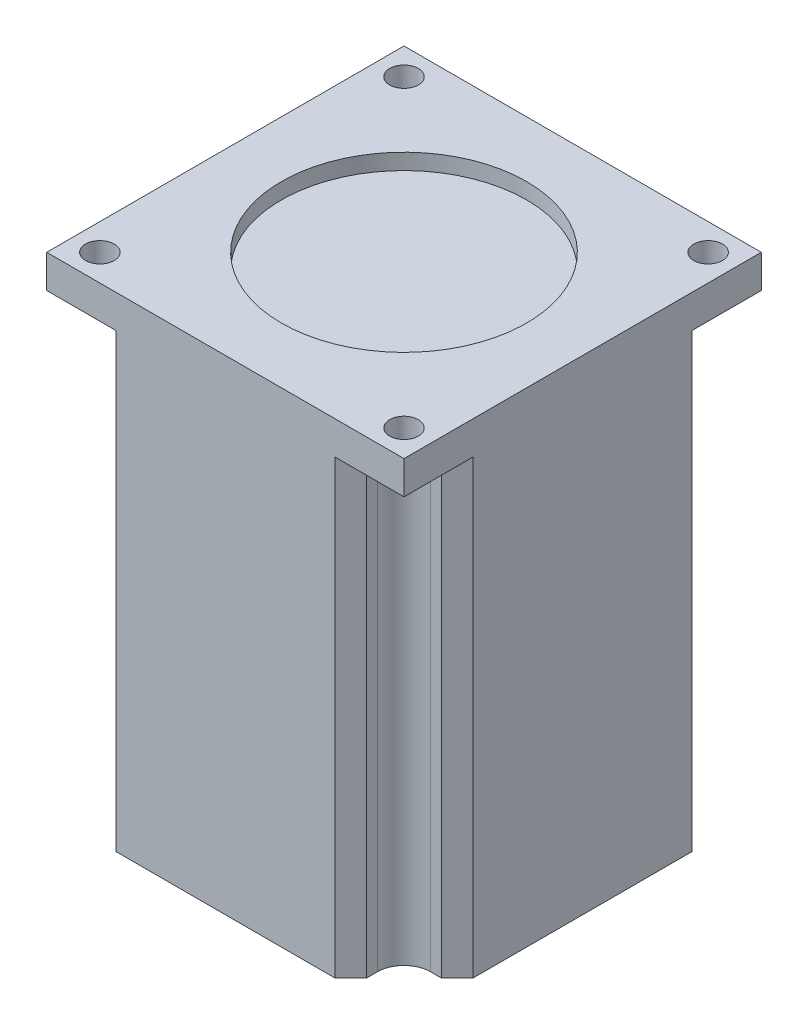
ISO-10303-21;
HEADER;
FILE_DESCRIPTION(('STEP AP214'),'2;1');
FILE_NAME('part.step','',(''),(''),'','','');
FILE_SCHEMA(('AUTOMOTIVE_DESIGN { 1 0 10303 214 1 1 1 1 }'));
ENDSEC;
DATA;
#1=APPLICATION_CONTEXT('core data for automotive mechanical design processes');
#2=APPLICATION_PROTOCOL_DEFINITION('international standard','automotive_design',2000,#1);
#3=PRODUCT_CONTEXT('',#1,'mechanical');
#4=PRODUCT('Part','Part','',(#3));
#5=PRODUCT_RELATED_PRODUCT_CATEGORY('part','',(#4));
#6=PRODUCT_DEFINITION_FORMATION('','',#4);
#7=PRODUCT_DEFINITION_CONTEXT('part definition',#1,'design');
#8=PRODUCT_DEFINITION('design','',#6,#7);
#9=PRODUCT_DEFINITION_SHAPE('','',#8);
#10=(LENGTH_UNIT() NAMED_UNIT(*) SI_UNIT(.MILLI.,.METRE.));
#11=(NAMED_UNIT(*) PLANE_ANGLE_UNIT() SI_UNIT($,.RADIAN.));
#12=(NAMED_UNIT(*) SI_UNIT($,.STERADIAN.) SOLID_ANGLE_UNIT());
#13=UNCERTAINTY_MEASURE_WITH_UNIT(LENGTH_MEASURE(1.E-05),#10,'distance_accuracy_value','');
#14=(GEOMETRIC_REPRESENTATION_CONTEXT(3) GLOBAL_UNCERTAINTY_ASSIGNED_CONTEXT((#13)) GLOBAL_UNIT_ASSIGNED_CONTEXT((#10,
#11,#12)) REPRESENTATION_CONTEXT('',''));
#15=CARTESIAN_POINT('',(0.,0.,0.));
#16=DIRECTION('',(0.,0.,1.));
#17=DIRECTION('',(1.,0.,0.));
#18=AXIS2_PLACEMENT_3D('',#15,#16,#17);
#19=CARTESIAN_POINT('',(0.,0.,0.));
#20=DIRECTION('',(0.,-1.,0.));
#21=DIRECTION('',(0.,0.,-1.));
#22=AXIS2_PLACEMENT_3D('',#19,#20,#21);
#23=PLANE('',#22);
#24=DIRECTION('',(-1.,0.,0.));
#25=VECTOR('',#24,1.);
#26=CARTESIAN_POINT('',(28.05,0.,-19.7));
#27=LINE('',#26,#25);
#28=CARTESIAN_POINT('',(25.55,0.,-19.7));
#29=VERTEX_POINT('',#28);
#30=CARTESIAN_POINT('',(23.875,0.,-19.7));
#31=VERTEX_POINT('',#30);
#32=EDGE_CURVE('E290',#29,#31,#27,.T.);
#33=ORIENTED_EDGE('',*,*,#32,.F.);
#34=DIRECTION('',(0.707106781186551,0.,0.707106781186544));
#35=VECTOR('',#34,1.);
#36=CARTESIAN_POINT('',(22.6249999999999,0.,-22.6250000000001));
#37=LINE('',#36,#35);
#38=CARTESIAN_POINT('',(28.05,0.,-17.2));
#39=VERTEX_POINT('',#38);
#40=EDGE_CURVE('E460',#29,#39,#37,.T.);
#41=ORIENTED_EDGE('',*,*,#40,.T.);
#42=DIRECTION('',(0.,0.,-1.));
#43=VECTOR('',#42,1.);
#44=CARTESIAN_POINT('',(28.05,0.,-28.05));
#45=LINE('',#44,#43);
#46=CARTESIAN_POINT('',(28.05,0.,17.2));
#47=VERTEX_POINT('',#46);
#48=EDGE_CURVE('E408',#47,#39,#45,.T.);
#49=ORIENTED_EDGE('',*,*,#48,.F.);
#50=DIRECTION('',(0.707106781186545,0.,-0.70710678118655));
#51=VECTOR('',#50,1.);
#52=CARTESIAN_POINT('',(22.6250000000001,0.,22.6249999999999));
#53=LINE('',#52,#51);
#54=CARTESIAN_POINT('',(25.55,0.,19.7));
#55=VERTEX_POINT('',#54);
#56=EDGE_CURVE('E236',#47,#55,#53,.F.);
#57=ORIENTED_EDGE('',*,*,#56,.T.);
#58=DIRECTION('',(-1.,0.,0.));
#59=VECTOR('',#58,1.);
#60=CARTESIAN_POINT('',(28.05,0.,19.7));
#61=LINE('',#60,#59);
#62=CARTESIAN_POINT('',(23.875,0.,19.7));
#63=VERTEX_POINT('',#62);
#64=EDGE_CURVE('E228',#55,#63,#61,.T.);
#65=ORIENTED_EDGE('',*,*,#64,.T.);
#66=CARTESIAN_POINT('',(23.875,0.,23.875));
#67=DIRECTION('',(0.,1.,0.));
#68=DIRECTION('',(0.,0.,-1.));
#69=AXIS2_PLACEMENT_3D('',#66,#67,#68);
#70=CIRCLE('',#69,4.17500000000001);
#71=CARTESIAN_POINT('',(19.7,0.,23.875));
#72=VERTEX_POINT('',#71);
#73=EDGE_CURVE('E233',#63,#72,#70,.T.);
#74=ORIENTED_EDGE('',*,*,#73,.T.);
#75=DIRECTION('',(0.,0.,1.));
#76=VECTOR('',#75,1.);
#77=CARTESIAN_POINT('',(19.7,0.,23.875));
#78=LINE('',#77,#76);
#79=CARTESIAN_POINT('',(19.7,0.,25.55));
#80=VERTEX_POINT('',#79);
#81=EDGE_CURVE('E253',#72,#80,#78,.T.);
#82=ORIENTED_EDGE('',*,*,#81,.T.);
#83=DIRECTION('',(0.707106781186546,0.,-0.707106781186549));
#84=VECTOR('',#83,1.);
#85=CARTESIAN_POINT('',(22.6250000000001,0.,22.6249999999999));
#86=LINE('',#85,#84);
#87=CARTESIAN_POINT('',(17.2,0.,28.05));
#88=VERTEX_POINT('',#87);
#89=EDGE_CURVE('E452',#80,#88,#86,.F.);
#90=ORIENTED_EDGE('',*,*,#89,.T.);
#91=DIRECTION('',(1.,0.,0.));
#92=VECTOR('',#91,1.);
#93=CARTESIAN_POINT('',(28.05,0.,28.05));
#94=LINE('',#93,#92);
#95=CARTESIAN_POINT('',(-17.2,0.,28.05));
#96=VERTEX_POINT('',#95);
#97=EDGE_CURVE('E404',#96,#88,#94,.T.);
#98=ORIENTED_EDGE('',*,*,#97,.F.);
#99=DIRECTION('',(-0.70710678118655,0.,-0.707106781186545));
#100=VECTOR('',#99,1.);
#101=CARTESIAN_POINT('',(-22.6249999999999,0.,22.6250000000001));
#102=LINE('',#101,#100);
#103=CARTESIAN_POINT('',(-19.7,0.,25.55));
#104=VERTEX_POINT('',#103);
#105=EDGE_CURVE('E449',#96,#104,#102,.T.);
#106=ORIENTED_EDGE('',*,*,#105,.T.);
#107=DIRECTION('',(0.,0.,1.));
#108=VECTOR('',#107,1.);
#109=CARTESIAN_POINT('',(-19.7,0.,23.875));
#110=LINE('',#109,#108);
#111=CARTESIAN_POINT('',(-19.7,0.,23.875));
#112=VERTEX_POINT('',#111);
#113=EDGE_CURVE('E316',#112,#104,#110,.T.);
#114=ORIENTED_EDGE('',*,*,#113,.F.);
#115=CARTESIAN_POINT('',(-23.875,0.,23.875));
#116=DIRECTION('',(0.,-1.,0.));
#117=DIRECTION('',(0.,0.,-1.));
#118=AXIS2_PLACEMENT_3D('',#115,#116,#117);
#119=CIRCLE('',#118,4.17500000000001);
#120=CARTESIAN_POINT('',(-23.875,0.,19.7));
#121=VERTEX_POINT('',#120);
#122=EDGE_CURVE('E320',#121,#112,#119,.T.);
#123=ORIENTED_EDGE('',*,*,#122,.F.);
#124=DIRECTION('',(1.,0.,0.));
#125=VECTOR('',#124,1.);
#126=CARTESIAN_POINT('',(-28.05,0.,19.7));
#127=LINE('',#126,#125);
#128=CARTESIAN_POINT('',(-25.55,0.,19.7));
#129=VERTEX_POINT('',#128);
#130=EDGE_CURVE('E325',#129,#121,#127,.T.);
#131=ORIENTED_EDGE('',*,*,#130,.F.);
#132=DIRECTION('',(-0.707106781186552,0.,-0.707106781186543));
#133=VECTOR('',#132,1.);
#134=CARTESIAN_POINT('',(-22.6249999999998,0.,22.6250000000001));
#135=LINE('',#134,#133);
#136=CARTESIAN_POINT('',(-28.05,0.,17.2));
#137=VERTEX_POINT('',#136);
#138=EDGE_CURVE('E446',#129,#137,#135,.T.);
#139=ORIENTED_EDGE('',*,*,#138,.T.);
#140=DIRECTION('',(0.,0.,1.));
#141=VECTOR('',#140,1.);
#142=CARTESIAN_POINT('',(-28.05,0.,-28.05));
#143=LINE('',#142,#141);
#144=CARTESIAN_POINT('',(-28.05,0.,-17.2));
#145=VERTEX_POINT('',#144);
#146=EDGE_CURVE('E382',#145,#137,#143,.T.);
#147=ORIENTED_EDGE('',*,*,#146,.F.);
#148=DIRECTION('',(-0.707106781186546,0.,0.707106781186549));
#149=VECTOR('',#148,1.);
#150=CARTESIAN_POINT('',(-22.6250000000001,0.,-22.6249999999999));
#151=LINE('',#150,#149);
#152=CARTESIAN_POINT('',(-25.55,0.,-19.7));
#153=VERTEX_POINT('',#152);
#154=EDGE_CURVE('E440',#145,#153,#151,.F.);
#155=ORIENTED_EDGE('',*,*,#154,.T.);
#156=DIRECTION('',(1.,0.,0.));
#157=VECTOR('',#156,1.);
#158=CARTESIAN_POINT('',(-28.05,0.,-19.7));
#159=LINE('',#158,#157);
#160=CARTESIAN_POINT('',(-23.875,0.,-19.7));
#161=VERTEX_POINT('',#160);
#162=EDGE_CURVE('E351',#153,#161,#159,.T.);
#163=ORIENTED_EDGE('',*,*,#162,.T.);
#164=CARTESIAN_POINT('',(-23.875,0.,-23.875));
#165=DIRECTION('',(0.,1.,0.));
#166=DIRECTION('',(0.,0.,1.));
#167=AXIS2_PLACEMENT_3D('',#164,#165,#166);
#168=CIRCLE('',#167,4.17500000000001);
#169=CARTESIAN_POINT('',(-19.7,0.,-23.875));
#170=VERTEX_POINT('',#169);
#171=EDGE_CURVE('E354',#161,#170,#168,.T.);
#172=ORIENTED_EDGE('',*,*,#171,.T.);
#173=DIRECTION('',(0.,0.,-1.));
#174=VECTOR('',#173,1.);
#175=CARTESIAN_POINT('',(-19.7,0.,-23.875));
#176=LINE('',#175,#174);
#177=CARTESIAN_POINT('',(-19.7,0.,-25.55));
#178=VERTEX_POINT('',#177);
#179=EDGE_CURVE('E359',#170,#178,#176,.T.);
#180=ORIENTED_EDGE('',*,*,#179,.T.);
#181=DIRECTION('',(-0.707106781186546,0.,0.707106781186549));
#182=VECTOR('',#181,1.);
#183=CARTESIAN_POINT('',(-22.625,0.,-22.6249999999999));
#184=LINE('',#183,#182);
#185=CARTESIAN_POINT('',(-17.2,0.,-28.05));
#186=VERTEX_POINT('',#185);
#187=EDGE_CURVE('E443',#178,#186,#184,.F.);
#188=ORIENTED_EDGE('',*,*,#187,.T.);
#189=DIRECTION('',(-1.,0.,0.));
#190=VECTOR('',#189,1.);
#191=CARTESIAN_POINT('',(28.05,0.,-28.05));
#192=LINE('',#191,#190);
#193=CARTESIAN_POINT('',(17.2,0.,-28.05));
#194=VERTEX_POINT('',#193);
#195=EDGE_CURVE('E391',#194,#186,#192,.T.);
#196=ORIENTED_EDGE('',*,*,#195,.F.);
#197=DIRECTION('',(0.707106781186549,0.,0.707106781186546));
#198=VECTOR('',#197,1.);
#199=CARTESIAN_POINT('',(22.625,0.,-22.6250000000001));
#200=LINE('',#199,#198);
#201=CARTESIAN_POINT('',(19.7,0.,-25.55));
#202=VERTEX_POINT('',#201);
#203=EDGE_CURVE('E457',#194,#202,#200,.T.);
#204=ORIENTED_EDGE('',*,*,#203,.T.);
#205=DIRECTION('',(0.,0.,-1.));
#206=VECTOR('',#205,1.);
#207=CARTESIAN_POINT('',(19.7,0.,-23.875));
#208=LINE('',#207,#206);
#209=CARTESIAN_POINT('',(19.7,0.,-23.875));
#210=VERTEX_POINT('',#209);
#211=EDGE_CURVE('E282',#210,#202,#208,.T.);
#212=ORIENTED_EDGE('',*,*,#211,.F.);
#213=CARTESIAN_POINT('',(23.875,0.,-23.875));
#214=DIRECTION('',(0.,-1.,0.));
#215=DIRECTION('',(0.,0.,1.));
#216=AXIS2_PLACEMENT_3D('',#213,#214,#215);
#217=CIRCLE('',#216,4.17500000000001);
#218=EDGE_CURVE('E286',#31,#210,#217,.T.);
#219=ORIENTED_EDGE('',*,*,#218,.F.);
#220=EDGE_LOOP('',(#33,#41,#49,#57,#65,#74,#82,#90,#98,#106,#114,#123,#131,#139,#147,#155,#163,
#172,#180,#188,#196,#204,#212,#219));
#221=FACE_BOUND('',#220,.T.);
#222=ADVANCED_FACE('F41',(#221),#23,.T.);
#223=CARTESIAN_POINT('',(28.05,76.05,-28.05));
#224=DIRECTION('',(-1.,0.,0.));
#225=DIRECTION('',(0.,0.,1.));
#226=AXIS2_PLACEMENT_3D('',#223,#224,#225);
#227=PLANE('',#226);
#228=ORIENTED_EDGE('',*,*,#48,.T.);
#229=DIRECTION('',(0.,1.,0.));
#230=VECTOR('',#229,1.);
#231=CARTESIAN_POINT('',(28.05,70.85,-17.2));
#232=LINE('',#231,#230);
#233=CARTESIAN_POINT('',(28.05,70.85,-17.2));
#234=VERTEX_POINT('',#233);
#235=EDGE_CURVE('E433',#39,#234,#232,.T.);
#236=ORIENTED_EDGE('',*,*,#235,.T.);
#237=DIRECTION('',(0.,0.,1.));
#238=VECTOR('',#237,1.);
#239=CARTESIAN_POINT('',(28.05,70.85,-19.7));
#240=LINE('',#239,#238);
#241=CARTESIAN_POINT('',(28.05,70.85,-28.05));
#242=VERTEX_POINT('',#241);
#243=EDGE_CURVE('E280',#242,#234,#240,.T.);
#244=ORIENTED_EDGE('',*,*,#243,.F.);
#245=DIRECTION('',(0.,-1.,0.));
#246=VECTOR('',#245,1.);
#247=CARTESIAN_POINT('',(28.05,76.05,-28.05));
#248=LINE('',#247,#246);
#249=CARTESIAN_POINT('',(28.05,76.05,-28.05));
#250=VERTEX_POINT('',#249);
#251=EDGE_CURVE('E418',#250,#242,#248,.T.);
#252=ORIENTED_EDGE('',*,*,#251,.F.);
#253=DIRECTION('',(0.,0.,-1.));
#254=VECTOR('',#253,1.);
#255=CARTESIAN_POINT('',(28.05,76.05,-28.05));
#256=LINE('',#255,#254);
#257=CARTESIAN_POINT('',(28.05,76.05,28.05));
#258=VERTEX_POINT('',#257);
#259=EDGE_CURVE('E394',#258,#250,#256,.T.);
#260=ORIENTED_EDGE('',*,*,#259,.F.);
#261=DIRECTION('',(0.,-1.,0.));
#262=VECTOR('',#261,1.);
#263=CARTESIAN_POINT('',(28.05,76.05,28.05));
#264=LINE('',#263,#262);
#265=CARTESIAN_POINT('',(28.05,70.85,28.05));
#266=VERTEX_POINT('',#265);
#267=EDGE_CURVE('E422',#258,#266,#264,.T.);
#268=ORIENTED_EDGE('',*,*,#267,.T.);
#269=DIRECTION('',(0.,0.,-1.));
#270=VECTOR('',#269,1.);
#271=CARTESIAN_POINT('',(28.05,70.85,19.7));
#272=LINE('',#271,#270);
#273=CARTESIAN_POINT('',(28.05,70.85,17.2));
#274=VERTEX_POINT('',#273);
#275=EDGE_CURVE('E263',#266,#274,#272,.T.);
#276=ORIENTED_EDGE('',*,*,#275,.T.);
#277=DIRECTION('',(0.,-1.,0.));
#278=VECTOR('',#277,1.);
#279=CARTESIAN_POINT('',(28.05,76.05,17.2));
#280=LINE('',#279,#278);
#281=EDGE_CURVE('E430',#274,#47,#280,.T.);
#282=ORIENTED_EDGE('',*,*,#281,.T.);
#283=EDGE_LOOP('',(#228,#236,#244,#252,#260,#268,#276,#282));
#284=FACE_BOUND('',#283,.T.);
#285=ADVANCED_FACE('F593',(#284),#227,.F.);
#286=CARTESIAN_POINT('',(28.05,76.05,-28.05));
#287=DIRECTION('',(0.,0.,1.));
#288=DIRECTION('',(1.,0.,0.));
#289=AXIS2_PLACEMENT_3D('',#286,#287,#288);
#290=PLANE('',#289);
#291=DIRECTION('',(1.,0.,0.));
#292=VECTOR('',#291,1.);
#293=CARTESIAN_POINT('',(28.05,70.85,-28.05));
#294=LINE('',#293,#292);
#295=CARTESIAN_POINT('',(17.2,70.85,-28.05));
#296=VERTEX_POINT('',#295);
#297=EDGE_CURVE('E296',#296,#242,#294,.T.);
#298=ORIENTED_EDGE('',*,*,#297,.F.);
#299=DIRECTION('',(0.,-1.,0.));
#300=VECTOR('',#299,1.);
#301=CARTESIAN_POINT('',(17.2,0.,-28.05));
#302=LINE('',#301,#300);
#303=EDGE_CURVE('E471',#296,#194,#302,.T.);
#304=ORIENTED_EDGE('',*,*,#303,.T.);
#305=ORIENTED_EDGE('',*,*,#195,.T.);
#306=DIRECTION('',(0.,1.,0.));
#307=VECTOR('',#306,1.);
#308=CARTESIAN_POINT('',(-17.2,76.05,-28.05));
#309=LINE('',#308,#307);
#310=CARTESIAN_POINT('',(-17.2,70.85,-28.05));
#311=VERTEX_POINT('',#310);
#312=EDGE_CURVE('E467',#186,#311,#309,.T.);
#313=ORIENTED_EDGE('',*,*,#312,.T.);
#314=DIRECTION('',(-1.,0.,0.));
#315=VECTOR('',#314,1.);
#316=CARTESIAN_POINT('',(-28.05,70.85,-28.05));
#317=LINE('',#316,#315);
#318=CARTESIAN_POINT('',(-28.05,70.85,-28.05));
#319=VERTEX_POINT('',#318);
#320=EDGE_CURVE('E355',#311,#319,#317,.T.);
#321=ORIENTED_EDGE('',*,*,#320,.T.);
#322=DIRECTION('',(0.,-1.,0.));
#323=VECTOR('',#322,1.);
#324=CARTESIAN_POINT('',(-28.05,76.05,-28.05));
#325=LINE('',#324,#323);
#326=CARTESIAN_POINT('',(-28.05,76.05,-28.05));
#327=VERTEX_POINT('',#326);
#328=EDGE_CURVE('E400',#327,#319,#325,.T.);
#329=ORIENTED_EDGE('',*,*,#328,.F.);
#330=DIRECTION('',(-1.,0.,0.));
#331=VECTOR('',#330,1.);
#332=CARTESIAN_POINT('',(28.05,76.05,-28.05));
#333=LINE('',#332,#331);
#334=EDGE_CURVE('E397',#250,#327,#333,.T.);
#335=ORIENTED_EDGE('',*,*,#334,.F.);
#336=ORIENTED_EDGE('',*,*,#251,.T.);
#337=EDGE_LOOP('',(#298,#304,#305,#313,#321,#329,#335,#336));
#338=FACE_BOUND('',#337,.T.);
#339=ADVANCED_FACE('F569',(#338),#290,.F.);
#340=CARTESIAN_POINT('',(-28.05,76.05,-28.05));
#341=DIRECTION('',(1.,0.,0.));
#342=DIRECTION('',(0.,0.,-1.));
#343=AXIS2_PLACEMENT_3D('',#340,#341,#342);
#344=PLANE('',#343);
#345=ORIENTED_EDGE('',*,*,#146,.T.);
#346=DIRECTION('',(0.,1.,0.));
#347=VECTOR('',#346,1.);
#348=CARTESIAN_POINT('',(-28.05,70.85,17.2));
#349=LINE('',#348,#347);
#350=CARTESIAN_POINT('',(-28.05,70.85,17.2));
#351=VERTEX_POINT('',#350);
#352=EDGE_CURVE('E494',#137,#351,#349,.T.);
#353=ORIENTED_EDGE('',*,*,#352,.T.);
#354=DIRECTION('',(0.,0.,-1.));
#355=VECTOR('',#354,1.);
#356=CARTESIAN_POINT('',(-28.05,70.85,19.7));
#357=LINE('',#356,#355);
#358=CARTESIAN_POINT('',(-28.05,70.85,28.05));
#359=VERTEX_POINT('',#358);
#360=EDGE_CURVE('E312',#359,#351,#357,.T.);
#361=ORIENTED_EDGE('',*,*,#360,.F.);
#362=DIRECTION('',(0.,-1.,0.));
#363=VECTOR('',#362,1.);
#364=CARTESIAN_POINT('',(-28.05,76.05,28.05));
#365=LINE('',#364,#363);
#366=CARTESIAN_POINT('',(-28.05,76.05,28.05));
#367=VERTEX_POINT('',#366);
#368=EDGE_CURVE('E426',#367,#359,#365,.T.);
#369=ORIENTED_EDGE('',*,*,#368,.F.);
#370=DIRECTION('',(0.,0.,1.));
#371=VECTOR('',#370,1.);
#372=CARTESIAN_POINT('',(-28.05,76.05,-28.05));
#373=LINE('',#372,#371);
#374=EDGE_CURVE('E386',#327,#367,#373,.T.);
#375=ORIENTED_EDGE('',*,*,#374,.F.);
#376=ORIENTED_EDGE('',*,*,#328,.T.);
#377=DIRECTION('',(0.,0.,1.));
#378=VECTOR('',#377,1.);
#379=CARTESIAN_POINT('',(-28.05,70.85,-19.7));
#380=LINE('',#379,#378);
#381=CARTESIAN_POINT('',(-28.05,70.85,-17.2));
#382=VERTEX_POINT('',#381);
#383=EDGE_CURVE('E347',#319,#382,#380,.T.);
#384=ORIENTED_EDGE('',*,*,#383,.T.);
#385=DIRECTION('',(0.,-1.,0.));
#386=VECTOR('',#385,1.);
#387=CARTESIAN_POINT('',(-28.05,76.05,-17.2));
#388=LINE('',#387,#386);
#389=EDGE_CURVE('E491',#382,#145,#388,.T.);
#390=ORIENTED_EDGE('',*,*,#389,.T.);
#391=EDGE_LOOP('',(#345,#353,#361,#369,#375,#376,#384,#390));
#392=FACE_BOUND('',#391,.T.);
#393=ADVANCED_FACE('F547',(#392),#344,.F.);
#394=CARTESIAN_POINT('',(28.05,76.05,28.05));
#395=DIRECTION('',(0.,0.,-1.));
#396=DIRECTION('',(-1.,0.,0.));
#397=AXIS2_PLACEMENT_3D('',#394,#395,#396);
#398=PLANE('',#397);
#399=ORIENTED_EDGE('',*,*,#97,.T.);
#400=DIRECTION('',(0.,1.,0.));
#401=VECTOR('',#400,1.);
#402=CARTESIAN_POINT('',(17.2,76.05,28.05));
#403=LINE('',#402,#401);
#404=CARTESIAN_POINT('',(17.2,70.85,28.05));
#405=VERTEX_POINT('',#404);
#406=EDGE_CURVE('E480',#88,#405,#403,.T.);
#407=ORIENTED_EDGE('',*,*,#406,.T.);
#408=DIRECTION('',(1.,0.,0.));
#409=VECTOR('',#408,1.);
#410=CARTESIAN_POINT('',(28.05,70.85,28.05));
#411=LINE('',#410,#409);
#412=EDGE_CURVE('E241',#405,#266,#411,.T.);
#413=ORIENTED_EDGE('',*,*,#412,.T.);
#414=ORIENTED_EDGE('',*,*,#267,.F.);
#415=DIRECTION('',(1.,0.,0.));
#416=VECTOR('',#415,1.);
#417=CARTESIAN_POINT('',(28.05,76.05,28.05));
#418=LINE('',#417,#416);
#419=EDGE_CURVE('E390',#367,#258,#418,.T.);
#420=ORIENTED_EDGE('',*,*,#419,.F.);
#421=ORIENTED_EDGE('',*,*,#368,.T.);
#422=DIRECTION('',(-1.,0.,0.));
#423=VECTOR('',#422,1.);
#424=CARTESIAN_POINT('',(-28.05,70.85,28.05));
#425=LINE('',#424,#423);
#426=CARTESIAN_POINT('',(-17.2,70.85,28.05));
#427=VERTEX_POINT('',#426);
#428=EDGE_CURVE('E331',#427,#359,#425,.T.);
#429=ORIENTED_EDGE('',*,*,#428,.F.);
#430=DIRECTION('',(0.,-1.,0.));
#431=VECTOR('',#430,1.);
#432=CARTESIAN_POINT('',(-17.2,0.,28.05));
#433=LINE('',#432,#431);
#434=EDGE_CURVE('E477',#427,#96,#433,.T.);
#435=ORIENTED_EDGE('',*,*,#434,.T.);
#436=EDGE_LOOP('',(#399,#407,#413,#414,#420,#421,#429,#435));
#437=FACE_BOUND('',#436,.T.);
#438=ADVANCED_FACE('F612',(#437),#398,.F.);
#439=CARTESIAN_POINT('',(0.,76.05,0.));
#440=DIRECTION('',(0.,-1.,0.));
#441=DIRECTION('',(0.,0.,-1.));
#442=AXIS2_PLACEMENT_3D('',#439,#440,#441);
#443=PLANE('',#442);
#444=CARTESIAN_POINT('',(0.,76.05,0.));
#445=DIRECTION('',(0.,1.,0.));
#446=DIRECTION('',(0.,0.,1.));
#447=AXIS2_PLACEMENT_3D('',#444,#445,#446);
#448=CIRCLE('',#447,19.25);
#449=CARTESIAN_POINT('',(0.,76.05,19.25));
#450=VERTEX_POINT('',#449);
#451=EDGE_CURVE('E887',#450,#450,#448,.T.);
#452=ORIENTED_EDGE('',*,*,#451,.F.);
#453=EDGE_LOOP('',(#452));
#454=FACE_BOUND('',#453,.T.);
#455=CARTESIAN_POINT('',(-23.875,76.05,23.875));
#456=DIRECTION('',(0.,-1.,0.));
#457=DIRECTION('',(0.,0.,1.));
#458=AXIS2_PLACEMENT_3D('',#455,#456,#457);
#459=CIRCLE('',#458,2.25);
#460=CARTESIAN_POINT('',(-23.875,76.05,26.125));
#461=VERTEX_POINT('',#460);
#462=EDGE_CURVE('E892',#461,#461,#459,.T.);
#463=ORIENTED_EDGE('',*,*,#462,.T.);
#464=EDGE_LOOP('',(#463));
#465=FACE_BOUND('',#464,.T.);
#466=CARTESIAN_POINT('',(-23.875,76.05,-23.875));
#467=DIRECTION('',(0.,1.,0.));
#468=DIRECTION('',(0.,0.,-1.));
#469=AXIS2_PLACEMENT_3D('',#466,#467,#468);
#470=CIRCLE('',#469,2.25);
#471=CARTESIAN_POINT('',(-23.875,76.05,-26.125));
#472=VERTEX_POINT('',#471);
#473=EDGE_CURVE('E901',#472,#472,#470,.T.);
#474=ORIENTED_EDGE('',*,*,#473,.F.);
#475=EDGE_LOOP('',(#474));
#476=FACE_BOUND('',#475,.T.);
#477=CARTESIAN_POINT('',(23.875,76.05,23.875));
#478=DIRECTION('',(0.,1.,0.));
#479=DIRECTION('',(0.,0.,1.));
#480=AXIS2_PLACEMENT_3D('',#477,#478,#479);
#481=CIRCLE('',#480,2.25);
#482=CARTESIAN_POINT('',(23.875,76.05,26.125));
#483=VERTEX_POINT('',#482);
#484=EDGE_CURVE('E909',#483,#483,#481,.T.);
#485=ORIENTED_EDGE('',*,*,#484,.F.);
#486=EDGE_LOOP('',(#485));
#487=FACE_BOUND('',#486,.T.);
#488=CARTESIAN_POINT('',(23.875,76.05,-23.875));
#489=DIRECTION('',(0.,-1.,0.));
#490=DIRECTION('',(0.,0.,-1.));
#491=AXIS2_PLACEMENT_3D('',#488,#489,#490);
#492=CIRCLE('',#491,2.25);
#493=CARTESIAN_POINT('',(23.875,76.05,-26.125));
#494=VERTEX_POINT('',#493);
#495=EDGE_CURVE('E266',#494,#494,#492,.T.);
#496=ORIENTED_EDGE('',*,*,#495,.T.);
#497=EDGE_LOOP('',(#496));
#498=FACE_BOUND('',#497,.T.);
#499=ORIENTED_EDGE('',*,*,#374,.T.);
#500=ORIENTED_EDGE('',*,*,#419,.T.);
#501=ORIENTED_EDGE('',*,*,#259,.T.);
#502=ORIENTED_EDGE('',*,*,#334,.T.);
#503=EDGE_LOOP('',(#499,#500,#501,#502));
#504=FACE_BOUND('',#503,.T.);
#505=ADVANCED_FACE('F628',(#454,#465,#476,#487,#498,#504),#443,.F.);
#506=CARTESIAN_POINT('',(-19.7,0.,-23.875));
#507=DIRECTION('',(1.,0.,0.));
#508=DIRECTION('',(0.,0.,-1.));
#509=AXIS2_PLACEMENT_3D('',#506,#507,#508);
#510=PLANE('',#509);
#511=DIRECTION('',(0.,0.,-1.));
#512=VECTOR('',#511,1.);
#513=CARTESIAN_POINT('',(-19.7,70.85,-23.875));
#514=LINE('',#513,#512);
#515=CARTESIAN_POINT('',(-19.7,70.85,-23.875));
#516=VERTEX_POINT('',#515);
#517=CARTESIAN_POINT('',(-19.7,70.85,-25.55));
#518=VERTEX_POINT('',#517);
#519=EDGE_CURVE('E373',#516,#518,#514,.T.);
#520=ORIENTED_EDGE('',*,*,#519,.T.);
#521=DIRECTION('',(0.,-1.,0.));
#522=VECTOR('',#521,1.);
#523=CARTESIAN_POINT('',(-19.7,0.,-25.55));
#524=LINE('',#523,#522);
#525=EDGE_CURVE('E501',#518,#178,#524,.T.);
#526=ORIENTED_EDGE('',*,*,#525,.T.);
#527=ORIENTED_EDGE('',*,*,#179,.F.);
#528=DIRECTION('',(0.,1.,0.));
#529=VECTOR('',#528,1.);
#530=CARTESIAN_POINT('',(-19.7,0.,-23.875));
#531=LINE('',#530,#529);
#532=EDGE_CURVE('E379',#170,#516,#531,.T.);
#533=ORIENTED_EDGE('',*,*,#532,.T.);
#534=EDGE_LOOP('',(#520,#526,#527,#533));
#535=FACE_BOUND('',#534,.T.);
#536=ADVANCED_FACE('F560',(#535),#510,.F.);
#537=CARTESIAN_POINT('',(-23.875,0.,-23.875));
#538=DIRECTION('',(0.,1.,0.));
#539=DIRECTION('',(0.,0.,1.));
#540=AXIS2_PLACEMENT_3D('',#537,#538,#539);
#541=CYLINDRICAL_SURFACE('',#540,4.17500000000001);
#542=CARTESIAN_POINT('',(-23.875,70.85,-23.875));
#543=DIRECTION('',(0.,1.,0.));
#544=DIRECTION('',(0.,0.,1.));
#545=AXIS2_PLACEMENT_3D('',#542,#543,#544);
#546=CIRCLE('',#545,4.17500000000001);
#547=CARTESIAN_POINT('',(-23.875,70.85,-19.7));
#548=VERTEX_POINT('',#547);
#549=EDGE_CURVE('E369',#548,#516,#546,.T.);
#550=ORIENTED_EDGE('',*,*,#549,.T.);
#551=ORIENTED_EDGE('',*,*,#532,.F.);
#552=ORIENTED_EDGE('',*,*,#171,.F.);
#553=DIRECTION('',(0.,1.,0.));
#554=VECTOR('',#553,1.);
#555=CARTESIAN_POINT('',(-23.875,0.,-19.7));
#556=LINE('',#555,#554);
#557=EDGE_CURVE('E363',#161,#548,#556,.T.);
#558=ORIENTED_EDGE('',*,*,#557,.T.);
#559=EDGE_LOOP('',(#550,#551,#552,#558));
#560=FACE_BOUND('',#559,.T.);
#561=ADVANCED_FACE('F556',(#560),#541,.F.);
#562=CARTESIAN_POINT('',(-28.05,0.,-19.7));
#563=DIRECTION('',(0.,0.,1.));
#564=DIRECTION('',(1.,0.,0.));
#565=AXIS2_PLACEMENT_3D('',#562,#563,#564);
#566=PLANE('',#565);
#567=ORIENTED_EDGE('',*,*,#162,.F.);
#568=DIRECTION('',(0.,1.,0.));
#569=VECTOR('',#568,1.);
#570=CARTESIAN_POINT('',(-25.55,0.,-19.7));
#571=LINE('',#570,#569);
#572=CARTESIAN_POINT('',(-25.55,70.85,-19.7));
#573=VERTEX_POINT('',#572);
#574=EDGE_CURVE('E504',#153,#573,#571,.T.);
#575=ORIENTED_EDGE('',*,*,#574,.T.);
#576=DIRECTION('',(1.,0.,0.));
#577=VECTOR('',#576,1.);
#578=CARTESIAN_POINT('',(-28.05,70.85,-19.7));
#579=LINE('',#578,#577);
#580=EDGE_CURVE('E366',#573,#548,#579,.T.);
#581=ORIENTED_EDGE('',*,*,#580,.T.);
#582=ORIENTED_EDGE('',*,*,#557,.F.);
#583=EDGE_LOOP('',(#567,#575,#581,#582));
#584=FACE_BOUND('',#583,.T.);
#585=ADVANCED_FACE('F552',(#584),#566,.F.);
#586=CARTESIAN_POINT('',(-23.875,70.85,-23.875));
#587=DIRECTION('',(0.,1.,0.));
#588=DIRECTION('',(0.,0.,1.));
#589=AXIS2_PLACEMENT_3D('',#586,#587,#588);
#590=PLANE('',#589);
#591=CARTESIAN_POINT('',(-23.875,70.85,-23.875));
#592=DIRECTION('',(0.,1.,0.));
#593=DIRECTION('',(0.,0.,-1.));
#594=AXIS2_PLACEMENT_3D('',#591,#592,#593);
#595=CIRCLE('',#594,2.25);
#596=CARTESIAN_POINT('',(-23.875,70.85,-26.125));
#597=VERTEX_POINT('',#596);
#598=EDGE_CURVE('E899',#597,#597,#595,.T.);
#599=ORIENTED_EDGE('',*,*,#598,.T.);
#600=EDGE_LOOP('',(#599));
#601=FACE_BOUND('',#600,.T.);
#602=ORIENTED_EDGE('',*,*,#383,.F.);
#603=ORIENTED_EDGE('',*,*,#320,.F.);
#604=DIRECTION('',(0.707106781186546,0.,-0.707106781186549));
#605=VECTOR('',#604,1.);
#606=CARTESIAN_POINT('',(-22.625,70.85,-22.625));
#607=LINE('',#606,#605);
#608=EDGE_CURVE('E51',#311,#518,#607,.F.);
#609=ORIENTED_EDGE('',*,*,#608,.T.);
#610=ORIENTED_EDGE('',*,*,#519,.F.);
#611=ORIENTED_EDGE('',*,*,#549,.F.);
#612=ORIENTED_EDGE('',*,*,#580,.F.);
#613=DIRECTION('',(0.707106781186546,0.,-0.707106781186549));
#614=VECTOR('',#613,1.);
#615=CARTESIAN_POINT('',(-22.625,70.85,-22.625));
#616=LINE('',#615,#614);
#617=EDGE_CURVE('E11',#573,#382,#616,.F.);
#618=ORIENTED_EDGE('',*,*,#617,.T.);
#619=EDGE_LOOP('',(#602,#603,#609,#610,#611,#612,#618));
#620=FACE_BOUND('',#619,.T.);
#621=ADVANCED_FACE('F557',(#601,#620),#590,.F.);
#622=CARTESIAN_POINT('',(-28.05,0.,19.7));
#623=DIRECTION('',(0.,0.,1.));
#624=DIRECTION('',(1.,0.,0.));
#625=AXIS2_PLACEMENT_3D('',#622,#623,#624);
#626=PLANE('',#625);
#627=DIRECTION('',(1.,0.,0.));
#628=VECTOR('',#627,1.);
#629=CARTESIAN_POINT('',(-28.05,70.85,19.7));
#630=LINE('',#629,#628);
#631=CARTESIAN_POINT('',(-25.55,70.85,19.7));
#632=VERTEX_POINT('',#631);
#633=CARTESIAN_POINT('',(-23.875,70.85,19.7));
#634=VERTEX_POINT('',#633);
#635=EDGE_CURVE('E321',#632,#634,#630,.T.);
#636=ORIENTED_EDGE('',*,*,#635,.F.);
#637=DIRECTION('',(0.,-1.,0.));
#638=VECTOR('',#637,1.);
#639=CARTESIAN_POINT('',(-25.55,0.,19.7));
#640=LINE('',#639,#638);
#641=EDGE_CURVE('E498',#632,#129,#640,.T.);
#642=ORIENTED_EDGE('',*,*,#641,.T.);
#643=ORIENTED_EDGE('',*,*,#130,.T.);
#644=DIRECTION('',(0.,1.,0.));
#645=VECTOR('',#644,1.);
#646=CARTESIAN_POINT('',(-23.875,0.,19.7));
#647=LINE('',#646,#645);
#648=EDGE_CURVE('E343',#121,#634,#647,.T.);
#649=ORIENTED_EDGE('',*,*,#648,.T.);
#650=EDGE_LOOP('',(#636,#642,#643,#649));
#651=FACE_BOUND('',#650,.T.);
#652=ADVANCED_FACE('F537',(#651),#626,.T.);
#653=CARTESIAN_POINT('',(-23.875,0.,23.875));
#654=DIRECTION('',(0.,1.,0.));
#655=DIRECTION('',(0.,0.,1.));
#656=AXIS2_PLACEMENT_3D('',#653,#654,#655);
#657=CYLINDRICAL_SURFACE('',#656,4.17500000000001);
#658=CARTESIAN_POINT('',(-23.875,70.85,23.875));
#659=DIRECTION('',(0.,-1.,0.));
#660=DIRECTION('',(0.,0.,-1.));
#661=AXIS2_PLACEMENT_3D('',#658,#659,#660);
#662=CIRCLE('',#661,4.17500000000001);
#663=CARTESIAN_POINT('',(-19.7,70.85,23.875));
#664=VERTEX_POINT('',#663);
#665=EDGE_CURVE('E338',#634,#664,#662,.T.);
#666=ORIENTED_EDGE('',*,*,#665,.F.);
#667=ORIENTED_EDGE('',*,*,#648,.F.);
#668=ORIENTED_EDGE('',*,*,#122,.T.);
#669=DIRECTION('',(0.,1.,0.));
#670=VECTOR('',#669,1.);
#671=CARTESIAN_POINT('',(-19.7,0.,23.875));
#672=LINE('',#671,#670);
#673=EDGE_CURVE('E328',#112,#664,#672,.T.);
#674=ORIENTED_EDGE('',*,*,#673,.T.);
#675=EDGE_LOOP('',(#666,#667,#668,#674));
#676=FACE_BOUND('',#675,.T.);
#677=ADVANCED_FACE('F622',(#676),#657,.F.);
#678=CARTESIAN_POINT('',(-19.7,0.,23.875));
#679=DIRECTION('',(-1.,0.,0.));
#680=DIRECTION('',(0.,0.,1.));
#681=AXIS2_PLACEMENT_3D('',#678,#679,#680);
#682=PLANE('',#681);
#683=ORIENTED_EDGE('',*,*,#113,.T.);
#684=DIRECTION('',(0.,1.,0.));
#685=VECTOR('',#684,1.);
#686=CARTESIAN_POINT('',(-19.7,70.85,25.55));
#687=LINE('',#686,#685);
#688=CARTESIAN_POINT('',(-19.7,70.85,25.55));
#689=VERTEX_POINT('',#688);
#690=EDGE_CURVE('E487',#104,#689,#687,.T.);
#691=ORIENTED_EDGE('',*,*,#690,.T.);
#692=DIRECTION('',(0.,0.,1.));
#693=VECTOR('',#692,1.);
#694=CARTESIAN_POINT('',(-19.7,70.85,23.875));
#695=LINE('',#694,#693);
#696=EDGE_CURVE('E334',#664,#689,#695,.T.);
#697=ORIENTED_EDGE('',*,*,#696,.F.);
#698=ORIENTED_EDGE('',*,*,#673,.F.);
#699=EDGE_LOOP('',(#683,#691,#697,#698));
#700=FACE_BOUND('',#699,.T.);
#701=ADVANCED_FACE('F619',(#700),#682,.T.);
#702=CARTESIAN_POINT('',(-23.875,70.85,23.875));
#703=DIRECTION('',(0.,1.,0.));
#704=DIRECTION('',(0.,0.,-1.));
#705=AXIS2_PLACEMENT_3D('',#702,#703,#704);
#706=PLANE('',#705);
#707=CARTESIAN_POINT('',(-23.875,70.85,23.875));
#708=DIRECTION('',(0.,-1.,0.));
#709=DIRECTION('',(0.,0.,1.));
#710=AXIS2_PLACEMENT_3D('',#707,#708,#709);
#711=CIRCLE('',#710,2.25);
#712=CARTESIAN_POINT('',(-23.875,70.85,26.125));
#713=VERTEX_POINT('',#712);
#714=EDGE_CURVE('E886',#713,#713,#711,.T.);
#715=ORIENTED_EDGE('',*,*,#714,.F.);
#716=EDGE_LOOP('',(#715));
#717=FACE_BOUND('',#716,.T.);
#718=ORIENTED_EDGE('',*,*,#360,.T.);
#719=DIRECTION('',(0.707106781186552,0.,0.707106781186543));
#720=VECTOR('',#719,1.);
#721=CARTESIAN_POINT('',(-22.625,70.85,22.625));
#722=LINE('',#721,#720);
#723=EDGE_CURVE('E525',#351,#632,#722,.T.);
#724=ORIENTED_EDGE('',*,*,#723,.T.);
#725=ORIENTED_EDGE('',*,*,#635,.T.);
#726=ORIENTED_EDGE('',*,*,#665,.T.);
#727=ORIENTED_EDGE('',*,*,#696,.T.);
#728=DIRECTION('',(0.70710678118655,0.,0.707106781186545));
#729=VECTOR('',#728,1.);
#730=CARTESIAN_POINT('',(-22.625,70.85,22.625));
#731=LINE('',#730,#729);
#732=EDGE_CURVE('E521',#689,#427,#731,.T.);
#733=ORIENTED_EDGE('',*,*,#732,.T.);
#734=ORIENTED_EDGE('',*,*,#428,.T.);
#735=EDGE_LOOP('',(#718,#724,#725,#726,#727,#733,#734));
#736=FACE_BOUND('',#735,.T.);
#737=ADVANCED_FACE('F531',(#717,#736),#706,.F.);
#738=CARTESIAN_POINT('',(28.05,0.,-19.7));
#739=DIRECTION('',(0.,0.,-1.));
#740=DIRECTION('',(-1.,0.,0.));
#741=AXIS2_PLACEMENT_3D('',#738,#739,#740);
#742=PLANE('',#741);
#743=DIRECTION('',(-1.,0.,0.));
#744=VECTOR('',#743,1.);
#745=CARTESIAN_POINT('',(28.05,70.85,-19.7));
#746=LINE('',#745,#744);
#747=CARTESIAN_POINT('',(25.55,70.85,-19.7));
#748=VERTEX_POINT('',#747);
#749=CARTESIAN_POINT('',(23.875,70.85,-19.7));
#750=VERTEX_POINT('',#749);
#751=EDGE_CURVE('E287',#748,#750,#746,.T.);
#752=ORIENTED_EDGE('',*,*,#751,.F.);
#753=DIRECTION('',(0.,-1.,0.));
#754=VECTOR('',#753,1.);
#755=CARTESIAN_POINT('',(25.55,0.,-19.7));
#756=LINE('',#755,#754);
#757=EDGE_CURVE('E437',#748,#29,#756,.T.);
#758=ORIENTED_EDGE('',*,*,#757,.T.);
#759=ORIENTED_EDGE('',*,*,#32,.T.);
#760=DIRECTION('',(0.,1.,0.));
#761=VECTOR('',#760,1.);
#762=CARTESIAN_POINT('',(23.875,0.,-19.7));
#763=LINE('',#762,#761);
#764=EDGE_CURVE('E308',#31,#750,#763,.T.);
#765=ORIENTED_EDGE('',*,*,#764,.T.);
#766=EDGE_LOOP('',(#752,#758,#759,#765));
#767=FACE_BOUND('',#766,.T.);
#768=ADVANCED_FACE('F720',(#767),#742,.T.);
#769=CARTESIAN_POINT('',(23.875,0.,-23.875));
#770=DIRECTION('',(0.,1.,0.));
#771=DIRECTION('',(0.,0.,1.));
#772=AXIS2_PLACEMENT_3D('',#769,#770,#771);
#773=CYLINDRICAL_SURFACE('',#772,4.17500000000001);
#774=CARTESIAN_POINT('',(23.875,70.85,-23.875));
#775=DIRECTION('',(0.,-1.,0.));
#776=DIRECTION('',(0.,0.,1.));
#777=AXIS2_PLACEMENT_3D('',#774,#775,#776);
#778=CIRCLE('',#777,4.17500000000001);
#779=CARTESIAN_POINT('',(19.7,70.85,-23.875));
#780=VERTEX_POINT('',#779);
#781=EDGE_CURVE('E303',#750,#780,#778,.T.);
#782=ORIENTED_EDGE('',*,*,#781,.F.);
#783=ORIENTED_EDGE('',*,*,#764,.F.);
#784=ORIENTED_EDGE('',*,*,#218,.T.);
#785=DIRECTION('',(0.,1.,0.));
#786=VECTOR('',#785,1.);
#787=CARTESIAN_POINT('',(19.7,0.,-23.875));
#788=LINE('',#787,#786);
#789=EDGE_CURVE('E293',#210,#780,#788,.T.);
#790=ORIENTED_EDGE('',*,*,#789,.T.);
#791=EDGE_LOOP('',(#782,#783,#784,#790));
#792=FACE_BOUND('',#791,.T.);
#793=ADVANCED_FACE('F582',(#792),#773,.F.);
#794=CARTESIAN_POINT('',(19.7,0.,-23.875));
#795=DIRECTION('',(1.,0.,0.));
#796=DIRECTION('',(0.,0.,-1.));
#797=AXIS2_PLACEMENT_3D('',#794,#795,#796);
#798=PLANE('',#797);
#799=ORIENTED_EDGE('',*,*,#211,.T.);
#800=DIRECTION('',(0.,1.,0.));
#801=VECTOR('',#800,1.);
#802=CARTESIAN_POINT('',(19.7,70.85,-25.55));
#803=LINE('',#802,#801);
#804=CARTESIAN_POINT('',(19.7,70.85,-25.55));
#805=VERTEX_POINT('',#804);
#806=EDGE_CURVE('E463',#202,#805,#803,.T.);
#807=ORIENTED_EDGE('',*,*,#806,.T.);
#808=DIRECTION('',(0.,0.,-1.));
#809=VECTOR('',#808,1.);
#810=CARTESIAN_POINT('',(19.7,70.85,-23.875));
#811=LINE('',#810,#809);
#812=EDGE_CURVE('E299',#780,#805,#811,.T.);
#813=ORIENTED_EDGE('',*,*,#812,.F.);
#814=ORIENTED_EDGE('',*,*,#789,.F.);
#815=EDGE_LOOP('',(#799,#807,#813,#814));
#816=FACE_BOUND('',#815,.T.);
#817=ADVANCED_FACE('F578',(#816),#798,.T.);
#818=CARTESIAN_POINT('',(23.875,70.85,-23.875));
#819=DIRECTION('',(0.,1.,0.));
#820=DIRECTION('',(0.,0.,1.));
#821=AXIS2_PLACEMENT_3D('',#818,#819,#820);
#822=PLANE('',#821);
#823=CARTESIAN_POINT('',(23.875,70.85,-23.875));
#824=DIRECTION('',(0.,-1.,0.));
#825=DIRECTION('',(0.,0.,-1.));
#826=AXIS2_PLACEMENT_3D('',#823,#824,#825);
#827=CIRCLE('',#826,2.25);
#828=CARTESIAN_POINT('',(23.875,70.85,-26.125));
#829=VERTEX_POINT('',#828);
#830=EDGE_CURVE('E913',#829,#829,#827,.T.);
#831=ORIENTED_EDGE('',*,*,#830,.F.);
#832=EDGE_LOOP('',(#831));
#833=FACE_BOUND('',#832,.T.);
#834=ORIENTED_EDGE('',*,*,#243,.T.);
#835=DIRECTION('',(-0.707106781186551,0.,-0.707106781186544));
#836=VECTOR('',#835,1.);
#837=CARTESIAN_POINT('',(22.625,70.85,-22.625));
#838=LINE('',#837,#836);
#839=EDGE_CURVE('E507',#234,#748,#838,.T.);
#840=ORIENTED_EDGE('',*,*,#839,.T.);
#841=ORIENTED_EDGE('',*,*,#751,.T.);
#842=ORIENTED_EDGE('',*,*,#781,.T.);
#843=ORIENTED_EDGE('',*,*,#812,.T.);
#844=DIRECTION('',(-0.707106781186549,0.,-0.707106781186546));
#845=VECTOR('',#844,1.);
#846=CARTESIAN_POINT('',(22.625,70.85,-22.625));
#847=LINE('',#846,#845);
#848=EDGE_CURVE('E510',#805,#296,#847,.T.);
#849=ORIENTED_EDGE('',*,*,#848,.T.);
#850=ORIENTED_EDGE('',*,*,#297,.T.);
#851=EDGE_LOOP('',(#834,#840,#841,#842,#843,#849,#850));
#852=FACE_BOUND('',#851,.T.);
#853=ADVANCED_FACE('F712',(#833,#852),#822,.F.);
#854=CARTESIAN_POINT('',(19.7,0.,23.875));
#855=DIRECTION('',(-1.,0.,0.));
#856=DIRECTION('',(0.,0.,1.));
#857=AXIS2_PLACEMENT_3D('',#854,#855,#856);
#858=PLANE('',#857);
#859=DIRECTION('',(0.,0.,1.));
#860=VECTOR('',#859,1.);
#861=CARTESIAN_POINT('',(19.7,70.85,23.875));
#862=LINE('',#861,#860);
#863=CARTESIAN_POINT('',(19.7,70.85,23.875));
#864=VERTEX_POINT('',#863);
#865=CARTESIAN_POINT('',(19.7,70.85,25.55));
#866=VERTEX_POINT('',#865);
#867=EDGE_CURVE('E272',#864,#866,#862,.T.);
#868=ORIENTED_EDGE('',*,*,#867,.T.);
#869=DIRECTION('',(0.,-1.,0.));
#870=VECTOR('',#869,1.);
#871=CARTESIAN_POINT('',(19.7,0.,25.55));
#872=LINE('',#871,#870);
#873=EDGE_CURVE('E484',#866,#80,#872,.T.);
#874=ORIENTED_EDGE('',*,*,#873,.T.);
#875=ORIENTED_EDGE('',*,*,#81,.F.);
#876=DIRECTION('',(0.,1.,0.));
#877=VECTOR('',#876,1.);
#878=CARTESIAN_POINT('',(19.7,0.,23.875));
#879=LINE('',#878,#877);
#880=EDGE_CURVE('E252',#72,#864,#879,.T.);
#881=ORIENTED_EDGE('',*,*,#880,.T.);
#882=EDGE_LOOP('',(#868,#874,#875,#881));
#883=FACE_BOUND('',#882,.T.);
#884=ADVANCED_FACE('F604',(#883),#858,.F.);
#885=CARTESIAN_POINT('',(23.875,0.,23.875));
#886=DIRECTION('',(0.,1.,0.));
#887=DIRECTION('',(0.,0.,1.));
#888=AXIS2_PLACEMENT_3D('',#885,#886,#887);
#889=CYLINDRICAL_SURFACE('',#888,4.17500000000001);
#890=CARTESIAN_POINT('',(23.875,70.85,23.875));
#891=DIRECTION('',(0.,1.,0.));
#892=DIRECTION('',(0.,0.,-1.));
#893=AXIS2_PLACEMENT_3D('',#890,#891,#892);
#894=CIRCLE('',#893,4.17500000000001);
#895=CARTESIAN_POINT('',(23.875,70.85,19.7));
#896=VERTEX_POINT('',#895);
#897=EDGE_CURVE('E269',#896,#864,#894,.T.);
#898=ORIENTED_EDGE('',*,*,#897,.T.);
#899=ORIENTED_EDGE('',*,*,#880,.F.);
#900=ORIENTED_EDGE('',*,*,#73,.F.);
#901=DIRECTION('',(0.,1.,0.));
#902=VECTOR('',#901,1.);
#903=CARTESIAN_POINT('',(23.875,0.,19.7));
#904=LINE('',#903,#902);
#905=EDGE_CURVE('E244',#63,#896,#904,.T.);
#906=ORIENTED_EDGE('',*,*,#905,.T.);
#907=EDGE_LOOP('',(#898,#899,#900,#906));
#908=FACE_BOUND('',#907,.T.);
#909=ADVANCED_FACE('F255',(#908),#889,.F.);
#910=CARTESIAN_POINT('',(28.05,0.,19.7));
#911=DIRECTION('',(0.,0.,-1.));
#912=DIRECTION('',(-1.,0.,0.));
#913=AXIS2_PLACEMENT_3D('',#910,#911,#912);
#914=PLANE('',#913);
#915=ORIENTED_EDGE('',*,*,#64,.F.);
#916=DIRECTION('',(0.,1.,0.));
#917=VECTOR('',#916,1.);
#918=CARTESIAN_POINT('',(25.55,0.,19.7));
#919=LINE('',#918,#917);
#920=CARTESIAN_POINT('',(25.55,70.85,19.7));
#921=VERTEX_POINT('',#920);
#922=EDGE_CURVE('E474',#55,#921,#919,.T.);
#923=ORIENTED_EDGE('',*,*,#922,.T.);
#924=DIRECTION('',(-1.,0.,0.));
#925=VECTOR('',#924,1.);
#926=CARTESIAN_POINT('',(28.05,70.85,19.7));
#927=LINE('',#926,#925);
#928=EDGE_CURVE('E247',#921,#896,#927,.T.);
#929=ORIENTED_EDGE('',*,*,#928,.T.);
#930=ORIENTED_EDGE('',*,*,#905,.F.);
#931=EDGE_LOOP('',(#915,#923,#929,#930));
#932=FACE_BOUND('',#931,.T.);
#933=ADVANCED_FACE('F245',(#932),#914,.F.);
#934=CARTESIAN_POINT('',(23.875,70.85,23.875));
#935=DIRECTION('',(0.,1.,0.));
#936=DIRECTION('',(0.,0.,-1.));
#937=AXIS2_PLACEMENT_3D('',#934,#935,#936);
#938=PLANE('',#937);
#939=CARTESIAN_POINT('',(23.875,70.85,23.875));
#940=DIRECTION('',(0.,1.,0.));
#941=DIRECTION('',(0.,0.,1.));
#942=AXIS2_PLACEMENT_3D('',#939,#940,#941);
#943=CIRCLE('',#942,2.25);
#944=CARTESIAN_POINT('',(23.875,70.85,26.125));
#945=VERTEX_POINT('',#944);
#946=EDGE_CURVE('E905',#945,#945,#943,.T.);
#947=ORIENTED_EDGE('',*,*,#946,.T.);
#948=EDGE_LOOP('',(#947));
#949=FACE_BOUND('',#948,.T.);
#950=ORIENTED_EDGE('',*,*,#275,.F.);
#951=ORIENTED_EDGE('',*,*,#412,.F.);
#952=DIRECTION('',(-0.707106781186546,0.,0.707106781186549));
#953=VECTOR('',#952,1.);
#954=CARTESIAN_POINT('',(22.625,70.85,22.625));
#955=LINE('',#954,#953);
#956=EDGE_CURVE('E518',#405,#866,#955,.F.);
#957=ORIENTED_EDGE('',*,*,#956,.T.);
#958=ORIENTED_EDGE('',*,*,#867,.F.);
#959=ORIENTED_EDGE('',*,*,#897,.F.);
#960=ORIENTED_EDGE('',*,*,#928,.F.);
#961=DIRECTION('',(-0.707106781186545,0.,0.70710678118655));
#962=VECTOR('',#961,1.);
#963=CARTESIAN_POINT('',(22.625,70.85,22.625));
#964=LINE('',#963,#962);
#965=EDGE_CURVE('E514',#921,#274,#964,.F.);
#966=ORIENTED_EDGE('',*,*,#965,.T.);
#967=EDGE_LOOP('',(#950,#951,#957,#958,#959,#960,#966));
#968=FACE_BOUND('',#967,.T.);
#969=ADVANCED_FACE('F599',(#949,#968),#938,.F.);
#970=CARTESIAN_POINT('',(28.05,76.05,-17.2));
#971=DIRECTION('',(0.707106781186543,0.,-0.707106781186551));
#972=DIRECTION('',(0.,-1.,0.));
#973=AXIS2_PLACEMENT_3D('',#970,#971,#972);
#974=PLANE('',#973);
#975=ORIENTED_EDGE('',*,*,#40,.F.);
#976=ORIENTED_EDGE('',*,*,#757,.F.);
#977=ORIENTED_EDGE('',*,*,#839,.F.);
#978=ORIENTED_EDGE('',*,*,#235,.F.);
#979=EDGE_LOOP('',(#975,#976,#977,#978));
#980=FACE_BOUND('',#979,.T.);
#981=ADVANCED_FACE('F589',(#980),#974,.T.);
#982=CARTESIAN_POINT('',(19.7,0.,-25.55));
#983=DIRECTION('',(0.707106781186546,0.,-0.707106781186549));
#984=DIRECTION('',(0.,-1.,0.));
#985=AXIS2_PLACEMENT_3D('',#982,#983,#984);
#986=PLANE('',#985);
#987=ORIENTED_EDGE('',*,*,#203,.F.);
#988=ORIENTED_EDGE('',*,*,#303,.F.);
#989=ORIENTED_EDGE('',*,*,#848,.F.);
#990=ORIENTED_EDGE('',*,*,#806,.F.);
#991=EDGE_LOOP('',(#987,#988,#989,#990));
#992=FACE_BOUND('',#991,.T.);
#993=ADVANCED_FACE('F572',(#992),#986,.T.);
#994=CARTESIAN_POINT('',(25.55,0.,19.7));
#995=DIRECTION('',(-0.70710678118655,0.,-0.707106781186545));
#996=DIRECTION('',(0.,1.,0.));
#997=AXIS2_PLACEMENT_3D('',#994,#995,#996);
#998=PLANE('',#997);
#999=ORIENTED_EDGE('',*,*,#56,.F.);
#1000=ORIENTED_EDGE('',*,*,#281,.F.);
#1001=ORIENTED_EDGE('',*,*,#965,.F.);
#1002=ORIENTED_EDGE('',*,*,#922,.F.);
#1003=EDGE_LOOP('',(#999,#1000,#1001,#1002));
#1004=FACE_BOUND('',#1003,.T.);
#1005=ADVANCED_FACE('F597',(#1004),#998,.F.);
#1006=CARTESIAN_POINT('',(17.2,76.05,28.05));
#1007=DIRECTION('',(-0.707106781186549,0.,-0.707106781186545));
#1008=DIRECTION('',(0.,1.,0.));
#1009=AXIS2_PLACEMENT_3D('',#1006,#1007,#1008);
#1010=PLANE('',#1009);
#1011=ORIENTED_EDGE('',*,*,#89,.F.);
#1012=ORIENTED_EDGE('',*,*,#873,.F.);
#1013=ORIENTED_EDGE('',*,*,#956,.F.);
#1014=ORIENTED_EDGE('',*,*,#406,.F.);
#1015=EDGE_LOOP('',(#1011,#1012,#1013,#1014));
#1016=FACE_BOUND('',#1015,.T.);
#1017=ADVANCED_FACE('F607',(#1016),#1010,.F.);
#1018=CARTESIAN_POINT('',(-19.7,0.,25.55));
#1019=DIRECTION('',(-0.707106781186544,0.,0.70710678118655));
#1020=DIRECTION('',(0.,-1.,0.));
#1021=AXIS2_PLACEMENT_3D('',#1018,#1019,#1020);
#1022=PLANE('',#1021);
#1023=ORIENTED_EDGE('',*,*,#105,.F.);
#1024=ORIENTED_EDGE('',*,*,#434,.F.);
#1025=ORIENTED_EDGE('',*,*,#732,.F.);
#1026=ORIENTED_EDGE('',*,*,#690,.F.);
#1027=EDGE_LOOP('',(#1023,#1024,#1025,#1026));
#1028=FACE_BOUND('',#1027,.T.);
#1029=ADVANCED_FACE('F615',(#1028),#1022,.T.);
#1030=CARTESIAN_POINT('',(-28.05,76.05,17.2));
#1031=DIRECTION('',(-0.707106781186543,0.,0.707106781186552));
#1032=DIRECTION('',(0.,-1.,0.));
#1033=AXIS2_PLACEMENT_3D('',#1030,#1031,#1032);
#1034=PLANE('',#1033);
#1035=ORIENTED_EDGE('',*,*,#138,.F.);
#1036=ORIENTED_EDGE('',*,*,#641,.F.);
#1037=ORIENTED_EDGE('',*,*,#723,.F.);
#1038=ORIENTED_EDGE('',*,*,#352,.F.);
#1039=EDGE_LOOP('',(#1035,#1036,#1037,#1038));
#1040=FACE_BOUND('',#1039,.T.);
#1041=ADVANCED_FACE('F542',(#1040),#1034,.T.);
#1042=CARTESIAN_POINT('',(-17.2,76.05,-28.05));
#1043=DIRECTION('',(0.707106781186549,0.,0.707106781186545));
#1044=DIRECTION('',(0.,1.,0.));
#1045=AXIS2_PLACEMENT_3D('',#1042,#1043,#1044);
#1046=PLANE('',#1045);
#1047=ORIENTED_EDGE('',*,*,#187,.F.);
#1048=ORIENTED_EDGE('',*,*,#525,.F.);
#1049=ORIENTED_EDGE('',*,*,#608,.F.);
#1050=ORIENTED_EDGE('',*,*,#312,.F.);
#1051=EDGE_LOOP('',(#1047,#1048,#1049,#1050));
#1052=FACE_BOUND('',#1051,.T.);
#1053=ADVANCED_FACE('F564',(#1052),#1046,.F.);
#1054=CARTESIAN_POINT('',(-25.55,0.,-19.7));
#1055=DIRECTION('',(0.707106781186549,0.,0.707106781186545));
#1056=DIRECTION('',(0.,1.,0.));
#1057=AXIS2_PLACEMENT_3D('',#1054,#1055,#1056);
#1058=PLANE('',#1057);
#1059=ORIENTED_EDGE('',*,*,#154,.F.);
#1060=ORIENTED_EDGE('',*,*,#389,.F.);
#1061=ORIENTED_EDGE('',*,*,#617,.F.);
#1062=ORIENTED_EDGE('',*,*,#574,.F.);
#1063=EDGE_LOOP('',(#1059,#1060,#1061,#1062));
#1064=FACE_BOUND('',#1063,.T.);
#1065=ADVANCED_FACE('F44',(#1064),#1058,.F.);
#1066=CARTESIAN_POINT('',(23.875,76.05,-23.875));
#1067=DIRECTION('',(0.,-1.,0.));
#1068=DIRECTION('',(0.,0.,-1.));
#1069=AXIS2_PLACEMENT_3D('',#1066,#1067,#1068);
#1070=CYLINDRICAL_SURFACE('',#1069,2.25);
#1071=ORIENTED_EDGE('',*,*,#495,.F.);
#1072=EDGE_LOOP('',(#1071));
#1073=FACE_BOUND('',#1072,.T.);
#1074=ORIENTED_EDGE('',*,*,#830,.T.);
#1075=EDGE_LOOP('',(#1074));
#1076=FACE_BOUND('',#1075,.T.);
#1077=ADVANCED_FACE('F690',(#1073,#1076),#1070,.F.);
#1078=CARTESIAN_POINT('',(23.875,76.05,23.875));
#1079=DIRECTION('',(0.,-1.,0.));
#1080=DIRECTION('',(0.,0.,-1.));
#1081=AXIS2_PLACEMENT_3D('',#1078,#1079,#1080);
#1082=CYLINDRICAL_SURFACE('',#1081,2.25);
#1083=ORIENTED_EDGE('',*,*,#484,.T.);
#1084=EDGE_LOOP('',(#1083));
#1085=FACE_BOUND('',#1084,.T.);
#1086=ORIENTED_EDGE('',*,*,#946,.F.);
#1087=EDGE_LOOP('',(#1086));
#1088=FACE_BOUND('',#1087,.T.);
#1089=ADVANCED_FACE('F694',(#1085,#1088),#1082,.F.);
#1090=CARTESIAN_POINT('',(-23.875,76.05,-23.875));
#1091=DIRECTION('',(0.,-1.,0.));
#1092=DIRECTION('',(0.,0.,-1.));
#1093=AXIS2_PLACEMENT_3D('',#1090,#1091,#1092);
#1094=CYLINDRICAL_SURFACE('',#1093,2.25);
#1095=ORIENTED_EDGE('',*,*,#473,.T.);
#1096=EDGE_LOOP('',(#1095));
#1097=FACE_BOUND('',#1096,.T.);
#1098=ORIENTED_EDGE('',*,*,#598,.F.);
#1099=EDGE_LOOP('',(#1098));
#1100=FACE_BOUND('',#1099,.T.);
#1101=ADVANCED_FACE('F700',(#1097,#1100),#1094,.F.);
#1102=CARTESIAN_POINT('',(-23.875,76.05,23.875));
#1103=DIRECTION('',(0.,-1.,0.));
#1104=DIRECTION('',(0.,0.,-1.));
#1105=AXIS2_PLACEMENT_3D('',#1102,#1103,#1104);
#1106=CYLINDRICAL_SURFACE('',#1105,2.25);
#1107=ORIENTED_EDGE('',*,*,#462,.F.);
#1108=EDGE_LOOP('',(#1107));
#1109=FACE_BOUND('',#1108,.T.);
#1110=ORIENTED_EDGE('',*,*,#714,.T.);
#1111=EDGE_LOOP('',(#1110));
#1112=FACE_BOUND('',#1111,.T.);
#1113=ADVANCED_FACE('F849',(#1109,#1112),#1106,.F.);
#1114=CARTESIAN_POINT('',(0.,73.55,0.));
#1115=DIRECTION('',(0.,1.,0.));
#1116=DIRECTION('',(0.,0.,1.));
#1117=AXIS2_PLACEMENT_3D('',#1114,#1115,#1116);
#1118=CYLINDRICAL_SURFACE('',#1117,19.25);
#1119=CARTESIAN_POINT('',(0.,73.55,0.));
#1120=DIRECTION('',(0.,1.,0.));
#1121=DIRECTION('',(0.,0.,1.));
#1122=AXIS2_PLACEMENT_3D('',#1119,#1120,#1121);
#1123=CIRCLE('',#1122,19.25);
#1124=CARTESIAN_POINT('',(0.,73.55,19.25));
#1125=VERTEX_POINT('',#1124);
#1126=EDGE_CURVE('E884',#1125,#1125,#1123,.T.);
#1127=ORIENTED_EDGE('',*,*,#1126,.F.);
#1128=EDGE_LOOP('',(#1127));
#1129=FACE_BOUND('',#1128,.T.);
#1130=ORIENTED_EDGE('',*,*,#451,.T.);
#1131=EDGE_LOOP('',(#1130));
#1132=FACE_BOUND('',#1131,.T.);
#1133=ADVANCED_FACE('F857',(#1129,#1132),#1118,.F.);
#1134=CARTESIAN_POINT('',(0.,73.55,0.));
#1135=DIRECTION('',(0.,1.,0.));
#1136=DIRECTION('',(0.,0.,1.));
#1137=AXIS2_PLACEMENT_3D('',#1134,#1135,#1136);
#1138=PLANE('',#1137);
#1139=ORIENTED_EDGE('',*,*,#1126,.T.);
#1140=EDGE_LOOP('',(#1139));
#1141=FACE_BOUND('',#1140,.T.);
#1142=ADVANCED_FACE('F866',(#1141),#1138,.T.);
#1143=CLOSED_SHELL('',(#222,#285,#339,#393,#438,#505,#536,#561,#585,#621,#652,#677,#701,#737,
#768,#793,#817,#853,#884,#909,#933,#969,#981,#993,#1005,#1017,#1029,#1041,#1053,#1065,#1077,
#1089,#1101,#1113,#1133,#1142));
#1144=MANIFOLD_SOLID_BREP('B2',#1143);
#1145=ADVANCED_BREP_SHAPE_REPRESENTATION('',(#18,#1144),#14);
#1146=SHAPE_DEFINITION_REPRESENTATION(#9,#1145);
ENDSEC;
END-ISO-10303-21;
